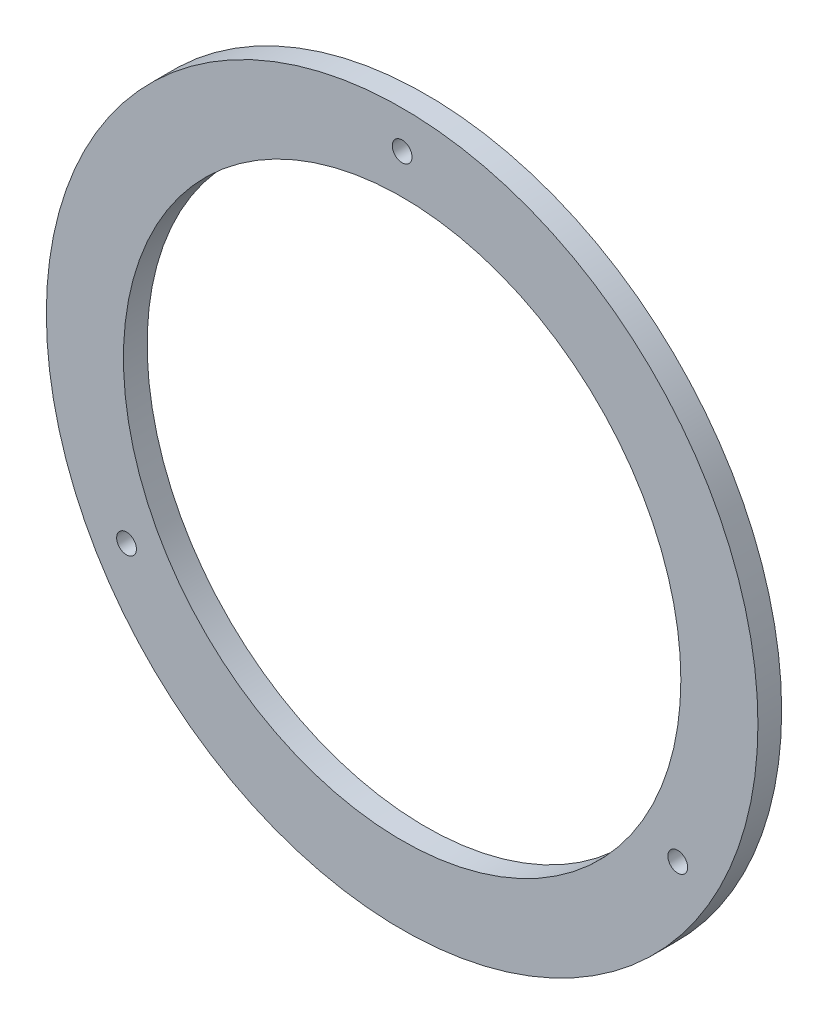
ISO-10303-21;
HEADER;
FILE_DESCRIPTION(('STEP AP214'),'2;1');
FILE_NAME('part.step','',(''),(''),'','','');
FILE_SCHEMA(('AUTOMOTIVE_DESIGN { 1 0 10303 214 1 1 1 1 }'));
ENDSEC;
DATA;
#1=APPLICATION_CONTEXT('core data for automotive mechanical design processes');
#2=APPLICATION_PROTOCOL_DEFINITION('international standard','automotive_design',2000,#1);
#3=PRODUCT_CONTEXT('',#1,'mechanical');
#4=PRODUCT('Part','Part','',(#3));
#5=PRODUCT_RELATED_PRODUCT_CATEGORY('part','',(#4));
#6=PRODUCT_DEFINITION_FORMATION('','',#4);
#7=PRODUCT_DEFINITION_CONTEXT('part definition',#1,'design');
#8=PRODUCT_DEFINITION('design','',#6,#7);
#9=PRODUCT_DEFINITION_SHAPE('','',#8);
#10=(LENGTH_UNIT() NAMED_UNIT(*) SI_UNIT(.MILLI.,.METRE.));
#11=(NAMED_UNIT(*) PLANE_ANGLE_UNIT() SI_UNIT($,.RADIAN.));
#12=(NAMED_UNIT(*) SI_UNIT($,.STERADIAN.) SOLID_ANGLE_UNIT());
#13=UNCERTAINTY_MEASURE_WITH_UNIT(LENGTH_MEASURE(1.E-05),#10,'distance_accuracy_value','');
#14=(GEOMETRIC_REPRESENTATION_CONTEXT(3) GLOBAL_UNCERTAINTY_ASSIGNED_CONTEXT((#13)) GLOBAL_UNIT_ASSIGNED_CONTEXT((#10,
#11,#12)) REPRESENTATION_CONTEXT('',''));
#15=CARTESIAN_POINT('',(0.,0.,0.));
#16=DIRECTION('',(0.,0.,1.));
#17=DIRECTION('',(1.,0.,0.));
#18=AXIS2_PLACEMENT_3D('',#15,#16,#17);
#19=CARTESIAN_POINT('',(0.,0.,3.));
#20=DIRECTION('',(0.,0.,1.));
#21=DIRECTION('',(1.,0.,0.));
#22=AXIS2_PLACEMENT_3D('',#19,#20,#21);
#23=PLANE('',#22);
#24=CARTESIAN_POINT('',(34.8575225023237,-20.125,3.));
#25=DIRECTION('',(0.,0.,1.));
#26=DIRECTION('',(1.,0.,0.));
#27=AXIS2_PLACEMENT_3D('',#24,#25,#26);
#28=CIRCLE('',#27,1.25);
#29=CARTESIAN_POINT('',(36.1075225023237,-20.125,3.));
#30=VERTEX_POINT('',#29);
#31=EDGE_CURVE('E37',#30,#30,#28,.T.);
#32=ORIENTED_EDGE('',*,*,#31,.F.);
#33=EDGE_LOOP('',(#32));
#34=FACE_BOUND('',#33,.T.);
#35=CARTESIAN_POINT('',(0.,0.,3.));
#36=DIRECTION('',(0.,0.,1.));
#37=DIRECTION('',(1.,0.,0.));
#38=AXIS2_PLACEMENT_3D('',#35,#36,#37);
#39=CIRCLE('',#38,35.25);
#40=CARTESIAN_POINT('',(35.25,0.,3.));
#41=VERTEX_POINT('',#40);
#42=EDGE_CURVE('E26',#41,#41,#39,.T.);
#43=ORIENTED_EDGE('',*,*,#42,.F.);
#44=EDGE_LOOP('',(#43));
#45=FACE_BOUND('',#44,.T.);
#46=CARTESIAN_POINT('',(0.,0.,3.));
#47=DIRECTION('',(0.,0.,1.));
#48=DIRECTION('',(1.,0.,0.));
#49=AXIS2_PLACEMENT_3D('',#46,#47,#48);
#50=CIRCLE('',#49,45.);
#51=CARTESIAN_POINT('',(45.,0.,3.));
#52=VERTEX_POINT('',#51);
#53=EDGE_CURVE('E10',#52,#52,#50,.T.);
#54=ORIENTED_EDGE('',*,*,#53,.T.);
#55=EDGE_LOOP('',(#54));
#56=FACE_BOUND('',#55,.T.);
#57=CARTESIAN_POINT('',(0.,40.25,3.));
#58=DIRECTION('',(0.,0.,1.));
#59=DIRECTION('',(1.,0.,0.));
#60=AXIS2_PLACEMENT_3D('',#57,#58,#59);
#61=CIRCLE('',#60,1.25);
#62=CARTESIAN_POINT('',(1.25,40.25,3.));
#63=VERTEX_POINT('',#62);
#64=EDGE_CURVE('E31',#63,#63,#61,.T.);
#65=ORIENTED_EDGE('',*,*,#64,.F.);
#66=EDGE_LOOP('',(#65));
#67=FACE_BOUND('',#66,.T.);
#68=CARTESIAN_POINT('',(-34.8575225023237,-20.125,3.));
#69=DIRECTION('',(0.,0.,1.));
#70=DIRECTION('',(1.,0.,0.));
#71=AXIS2_PLACEMENT_3D('',#68,#69,#70);
#72=CIRCLE('',#71,1.25);
#73=CARTESIAN_POINT('',(-33.6075225023237,-20.125,3.));
#74=VERTEX_POINT('',#73);
#75=EDGE_CURVE('E43',#74,#74,#72,.T.);
#76=ORIENTED_EDGE('',*,*,#75,.F.);
#77=EDGE_LOOP('',(#76));
#78=FACE_BOUND('',#77,.T.);
#79=ADVANCED_FACE('F15',(#34,#45,#56,#67,#78),#23,.T.);
#80=CARTESIAN_POINT('',(0.,0.,0.));
#81=DIRECTION('',(0.,0.,1.));
#82=DIRECTION('',(1.,0.,0.));
#83=AXIS2_PLACEMENT_3D('',#80,#81,#82);
#84=PLANE('',#83);
#85=CARTESIAN_POINT('',(0.,0.,0.));
#86=DIRECTION('',(0.,0.,1.));
#87=DIRECTION('',(1.,0.,0.));
#88=AXIS2_PLACEMENT_3D('',#85,#86,#87);
#89=CIRCLE('',#88,45.);
#90=CARTESIAN_POINT('',(45.,0.,0.));
#91=VERTEX_POINT('',#90);
#92=EDGE_CURVE('E19',#91,#91,#89,.T.);
#93=ORIENTED_EDGE('',*,*,#92,.F.);
#94=EDGE_LOOP('',(#93));
#95=FACE_BOUND('',#94,.T.);
#96=CARTESIAN_POINT('',(0.,0.,0.));
#97=DIRECTION('',(0.,0.,1.));
#98=DIRECTION('',(1.,0.,0.));
#99=AXIS2_PLACEMENT_3D('',#96,#97,#98);
#100=CIRCLE('',#99,35.25);
#101=CARTESIAN_POINT('',(35.25,0.,0.));
#102=VERTEX_POINT('',#101);
#103=EDGE_CURVE('E28',#102,#102,#100,.T.);
#104=ORIENTED_EDGE('',*,*,#103,.T.);
#105=EDGE_LOOP('',(#104));
#106=FACE_BOUND('',#105,.T.);
#107=CARTESIAN_POINT('',(0.,40.25,0.));
#108=DIRECTION('',(0.,0.,1.));
#109=DIRECTION('',(1.,0.,0.));
#110=AXIS2_PLACEMENT_3D('',#107,#108,#109);
#111=CIRCLE('',#110,1.25);
#112=CARTESIAN_POINT('',(1.25,40.25,0.));
#113=VERTEX_POINT('',#112);
#114=EDGE_CURVE('E34',#113,#113,#111,.T.);
#115=ORIENTED_EDGE('',*,*,#114,.T.);
#116=EDGE_LOOP('',(#115));
#117=FACE_BOUND('',#116,.T.);
#118=CARTESIAN_POINT('',(34.8575225023237,-20.125,0.));
#119=DIRECTION('',(0.,0.,1.));
#120=DIRECTION('',(1.,0.,0.));
#121=AXIS2_PLACEMENT_3D('',#118,#119,#120);
#122=CIRCLE('',#121,1.25);
#123=CARTESIAN_POINT('',(36.1075225023237,-20.125,0.));
#124=VERTEX_POINT('',#123);
#125=EDGE_CURVE('E40',#124,#124,#122,.T.);
#126=ORIENTED_EDGE('',*,*,#125,.T.);
#127=EDGE_LOOP('',(#126));
#128=FACE_BOUND('',#127,.T.);
#129=CARTESIAN_POINT('',(-34.8575225023237,-20.125,0.));
#130=DIRECTION('',(0.,0.,1.));
#131=DIRECTION('',(1.,0.,0.));
#132=AXIS2_PLACEMENT_3D('',#129,#130,#131);
#133=CIRCLE('',#132,1.25);
#134=CARTESIAN_POINT('',(-33.6075225023237,-20.125,0.));
#135=VERTEX_POINT('',#134);
#136=EDGE_CURVE('E46',#135,#135,#133,.T.);
#137=ORIENTED_EDGE('',*,*,#136,.T.);
#138=EDGE_LOOP('',(#137));
#139=FACE_BOUND('',#138,.T.);
#140=ADVANCED_FACE('F56',(#95,#106,#117,#128,#139),#84,.F.);
#141=CARTESIAN_POINT('',(0.,0.,3.));
#142=DIRECTION('',(0.,0.,-1.));
#143=DIRECTION('',(-1.,0.,0.));
#144=AXIS2_PLACEMENT_3D('',#141,#142,#143);
#145=CYLINDRICAL_SURFACE('',#144,45.);
#146=ORIENTED_EDGE('',*,*,#53,.F.);
#147=EDGE_LOOP('',(#146));
#148=FACE_BOUND('',#147,.T.);
#149=ORIENTED_EDGE('',*,*,#92,.T.);
#150=EDGE_LOOP('',(#149));
#151=FACE_BOUND('',#150,.T.);
#152=ADVANCED_FACE('F17',(#148,#151),#145,.T.);
#153=CARTESIAN_POINT('',(0.,0.,3.));
#154=DIRECTION('',(0.,0.,-1.));
#155=DIRECTION('',(-1.,0.,0.));
#156=AXIS2_PLACEMENT_3D('',#153,#154,#155);
#157=CYLINDRICAL_SURFACE('',#156,35.25);
#158=ORIENTED_EDGE('',*,*,#42,.T.);
#159=EDGE_LOOP('',(#158));
#160=FACE_BOUND('',#159,.T.);
#161=ORIENTED_EDGE('',*,*,#103,.F.);
#162=EDGE_LOOP('',(#161));
#163=FACE_BOUND('',#162,.T.);
#164=ADVANCED_FACE('F68',(#160,#163),#157,.F.);
#165=CARTESIAN_POINT('',(0.,40.25,3.));
#166=DIRECTION('',(0.,0.,-1.));
#167=DIRECTION('',(-1.,0.,0.));
#168=AXIS2_PLACEMENT_3D('',#165,#166,#167);
#169=CYLINDRICAL_SURFACE('',#168,1.25);
#170=ORIENTED_EDGE('',*,*,#64,.T.);
#171=EDGE_LOOP('',(#170));
#172=FACE_BOUND('',#171,.T.);
#173=ORIENTED_EDGE('',*,*,#114,.F.);
#174=EDGE_LOOP('',(#173));
#175=FACE_BOUND('',#174,.T.);
#176=ADVANCED_FACE('F71',(#172,#175),#169,.F.);
#177=CARTESIAN_POINT('',(34.8575225023237,-20.125,3.));
#178=DIRECTION('',(0.,0.,-1.));
#179=DIRECTION('',(-1.,0.,0.));
#180=AXIS2_PLACEMENT_3D('',#177,#178,#179);
#181=CYLINDRICAL_SURFACE('',#180,1.25);
#182=ORIENTED_EDGE('',*,*,#31,.T.);
#183=EDGE_LOOP('',(#182));
#184=FACE_BOUND('',#183,.T.);
#185=ORIENTED_EDGE('',*,*,#125,.F.);
#186=EDGE_LOOP('',(#185));
#187=FACE_BOUND('',#186,.T.);
#188=ADVANCED_FACE('F75',(#184,#187),#181,.F.);
#189=CARTESIAN_POINT('',(-34.8575225023237,-20.125,3.));
#190=DIRECTION('',(0.,0.,-1.));
#191=DIRECTION('',(-1.,0.,0.));
#192=AXIS2_PLACEMENT_3D('',#189,#190,#191);
#193=CYLINDRICAL_SURFACE('',#192,1.25);
#194=ORIENTED_EDGE('',*,*,#75,.T.);
#195=EDGE_LOOP('',(#194));
#196=FACE_BOUND('',#195,.T.);
#197=ORIENTED_EDGE('',*,*,#136,.F.);
#198=EDGE_LOOP('',(#197));
#199=FACE_BOUND('',#198,.T.);
#200=ADVANCED_FACE('F52',(#196,#199),#193,.F.);
#201=CLOSED_SHELL('',(#79,#140,#152,#164,#176,#188,#200));
#202=MANIFOLD_SOLID_BREP('B1',#201);
#203=ADVANCED_BREP_SHAPE_REPRESENTATION('',(#18,#202),#14);
#204=SHAPE_DEFINITION_REPRESENTATION(#9,#203);
ENDSEC;
END-ISO-10303-21;
